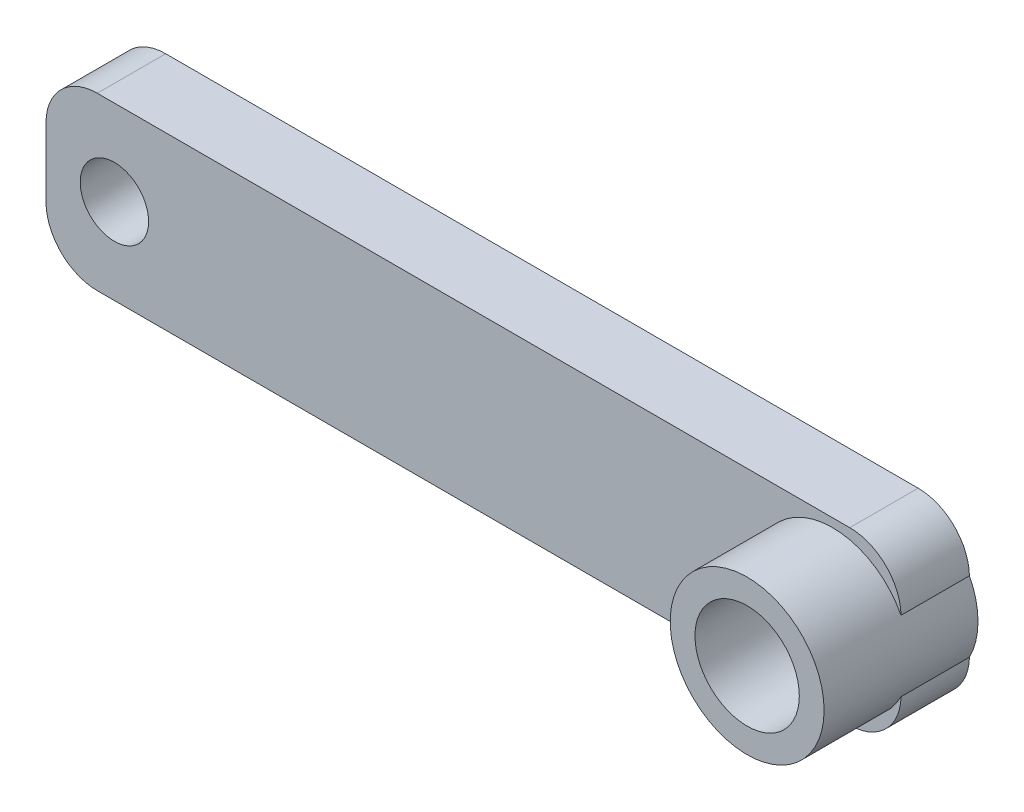
ISO-10303-21;
HEADER;
FILE_DESCRIPTION(('STEP AP214'),'2;1');
FILE_NAME('part.step','',(''),(''),'','','');
FILE_SCHEMA(('AUTOMOTIVE_DESIGN { 1 0 10303 214 1 1 1 1 }'));
ENDSEC;
DATA;
#1=APPLICATION_CONTEXT('core data for automotive mechanical design processes');
#2=APPLICATION_PROTOCOL_DEFINITION('international standard','automotive_design',2000,#1);
#3=PRODUCT_CONTEXT('',#1,'mechanical');
#4=PRODUCT('Part','Part','',(#3));
#5=PRODUCT_RELATED_PRODUCT_CATEGORY('part','',(#4));
#6=PRODUCT_DEFINITION_FORMATION('','',#4);
#7=PRODUCT_DEFINITION_CONTEXT('part definition',#1,'design');
#8=PRODUCT_DEFINITION('design','',#6,#7);
#9=PRODUCT_DEFINITION_SHAPE('','',#8);
#10=(LENGTH_UNIT() NAMED_UNIT(*) SI_UNIT(.MILLI.,.METRE.));
#11=(NAMED_UNIT(*) PLANE_ANGLE_UNIT() SI_UNIT($,.RADIAN.));
#12=(NAMED_UNIT(*) SI_UNIT($,.STERADIAN.) SOLID_ANGLE_UNIT());
#13=UNCERTAINTY_MEASURE_WITH_UNIT(LENGTH_MEASURE(1.E-05),#10,'distance_accuracy_value','');
#14=(GEOMETRIC_REPRESENTATION_CONTEXT(3) GLOBAL_UNCERTAINTY_ASSIGNED_CONTEXT((#13)) GLOBAL_UNIT_ASSIGNED_CONTEXT((#10,
#11,#12)) REPRESENTATION_CONTEXT('',''));
#15=CARTESIAN_POINT('',(0.,0.,0.));
#16=DIRECTION('',(0.,0.,1.));
#17=DIRECTION('',(1.,0.,0.));
#18=AXIS2_PLACEMENT_3D('',#15,#16,#17);
#19=CARTESIAN_POINT('',(0.,0.,4.));
#20=DIRECTION('',(0.,0.,1.));
#21=DIRECTION('',(1.,0.,0.));
#22=AXIS2_PLACEMENT_3D('',#19,#20,#21);
#23=PLANE('',#22);
#24=DIRECTION('',(1.,0.,0.));
#25=VECTOR('',#24,1.);
#26=CARTESIAN_POINT('',(-25.,-4.99999999999999,4.));
#27=LINE('',#26,#25);
#28=CARTESIAN_POINT('',(-22.,-4.99999999999999,4.));
#29=VERTEX_POINT('',#28);
#30=CARTESIAN_POINT('',(22.000631524598,-4.99999999999998,4.));
#31=VERTEX_POINT('',#30);
#32=EDGE_CURVE('E135',#29,#31,#27,.T.);
#33=ORIENTED_EDGE('',*,*,#32,.T.);
#34=CARTESIAN_POINT('',(22.000631524598,-1.99999999999998,4.));
#35=DIRECTION('',(0.,0.,1.));
#36=DIRECTION('',(1.,0.,0.));
#37=AXIS2_PLACEMENT_3D('',#34,#35,#36);
#38=CIRCLE('',#37,3.);
#39=CARTESIAN_POINT('',(25.,-2.06155281280883,4.));
#40=VERTEX_POINT('',#39);
#41=EDGE_CURVE('E168',#31,#40,#38,.T.);
#42=ORIENTED_EDGE('',*,*,#41,.T.);
#43=CARTESIAN_POINT('',(21.,0.,4.));
#44=DIRECTION('',(0.,0.,1.));
#45=DIRECTION('',(1.,0.,0.));
#46=AXIS2_PLACEMENT_3D('',#43,#44,#45);
#47=CIRCLE('',#46,4.5);
#48=CARTESIAN_POINT('',(25.,2.06155281280882,4.));
#49=VERTEX_POINT('',#48);
#50=EDGE_CURVE('E129',#49,#40,#47,.T.);
#51=ORIENTED_EDGE('',*,*,#50,.F.);
#52=CARTESIAN_POINT('',(22.000631524598,1.99999999999999,4.));
#53=DIRECTION('',(0.,0.,1.));
#54=DIRECTION('',(1.,0.,0.));
#55=AXIS2_PLACEMENT_3D('',#52,#53,#54);
#56=CIRCLE('',#55,3.);
#57=CARTESIAN_POINT('',(22.000631524598,4.99999999999999,4.));
#58=VERTEX_POINT('',#57);
#59=EDGE_CURVE('E133',#49,#58,#56,.T.);
#60=ORIENTED_EDGE('',*,*,#59,.T.);
#61=DIRECTION('',(-1.,0.,0.));
#62=VECTOR('',#61,1.);
#63=CARTESIAN_POINT('',(-25.,5.00000000000001,4.));
#64=LINE('',#63,#62);
#65=CARTESIAN_POINT('',(-22.,5.00000000000001,4.));
#66=VERTEX_POINT('',#65);
#67=EDGE_CURVE('E188',#58,#66,#64,.T.);
#68=ORIENTED_EDGE('',*,*,#67,.T.);
#69=CARTESIAN_POINT('',(-22.,2.00000000000001,4.));
#70=DIRECTION('',(0.,0.,1.));
#71=DIRECTION('',(1.,0.,0.));
#72=AXIS2_PLACEMENT_3D('',#69,#70,#71);
#73=CIRCLE('',#72,3.);
#74=CARTESIAN_POINT('',(-25.,2.00000000000001,4.));
#75=VERTEX_POINT('',#74);
#76=EDGE_CURVE('E59',#66,#75,#73,.T.);
#77=ORIENTED_EDGE('',*,*,#76,.T.);
#78=DIRECTION('',(0.,-1.,0.));
#79=VECTOR('',#78,1.);
#80=CARTESIAN_POINT('',(-25.,5.00000000000001,4.));
#81=LINE('',#80,#79);
#82=CARTESIAN_POINT('',(-25.,-1.99999999999999,4.));
#83=VERTEX_POINT('',#82);
#84=EDGE_CURVE('E142',#75,#83,#81,.T.);
#85=ORIENTED_EDGE('',*,*,#84,.T.);
#86=CARTESIAN_POINT('',(-22.,-1.99999999999999,4.));
#87=DIRECTION('',(0.,0.,1.));
#88=DIRECTION('',(1.,0.,0.));
#89=AXIS2_PLACEMENT_3D('',#86,#87,#88);
#90=CIRCLE('',#89,3.);
#91=EDGE_CURVE('E163',#83,#29,#90,.T.);
#92=ORIENTED_EDGE('',*,*,#91,.T.);
#93=EDGE_LOOP('',(#33,#42,#51,#60,#68,#77,#85,#92));
#94=FACE_BOUND('',#93,.T.);
#95=CARTESIAN_POINT('',(-21.,0.,4.));
#96=DIRECTION('',(0.,0.,1.));
#97=DIRECTION('',(1.,0.,0.));
#98=AXIS2_PLACEMENT_3D('',#95,#96,#97);
#99=CIRCLE('',#98,2.);
#100=CARTESIAN_POINT('',(-19.,0.,4.));
#101=VERTEX_POINT('',#100);
#102=EDGE_CURVE('E189',#101,#101,#99,.T.);
#103=ORIENTED_EDGE('',*,*,#102,.F.);
#104=EDGE_LOOP('',(#103));
#105=FACE_BOUND('',#104,.T.);
#106=ADVANCED_FACE('F38',(#94,#105),#23,.T.);
#107=CARTESIAN_POINT('',(0.,0.,0.));
#108=DIRECTION('',(0.,0.,1.));
#109=DIRECTION('',(1.,0.,0.));
#110=AXIS2_PLACEMENT_3D('',#107,#108,#109);
#111=PLANE('',#110);
#112=CARTESIAN_POINT('',(21.,0.,0.));
#113=DIRECTION('',(0.,0.,1.));
#114=DIRECTION('',(1.,0.,0.));
#115=AXIS2_PLACEMENT_3D('',#112,#113,#114);
#116=CIRCLE('',#115,4.5);
#117=CARTESIAN_POINT('',(25.,-2.06155281280883,0.));
#118=VERTEX_POINT('',#117);
#119=CARTESIAN_POINT('',(25.,2.06155281280882,0.));
#120=VERTEX_POINT('',#119);
#121=EDGE_CURVE('E108',#118,#120,#116,.T.);
#122=ORIENTED_EDGE('',*,*,#121,.F.);
#123=CARTESIAN_POINT('',(22.000631524598,-1.99999999999998,0.));
#124=DIRECTION('',(0.,0.,1.));
#125=DIRECTION('',(1.,0.,0.));
#126=AXIS2_PLACEMENT_3D('',#123,#124,#125);
#127=CIRCLE('',#126,3.);
#128=CARTESIAN_POINT('',(22.000631524598,-4.99999999999998,0.));
#129=VERTEX_POINT('',#128);
#130=EDGE_CURVE('E116',#118,#129,#127,.F.);
#131=ORIENTED_EDGE('',*,*,#130,.T.);
#132=DIRECTION('',(1.,0.,0.));
#133=VECTOR('',#132,1.);
#134=CARTESIAN_POINT('',(-25.,-4.99999999999999,0.));
#135=LINE('',#134,#133);
#136=CARTESIAN_POINT('',(-22.,-4.99999999999999,0.));
#137=VERTEX_POINT('',#136);
#138=EDGE_CURVE('E145',#137,#129,#135,.T.);
#139=ORIENTED_EDGE('',*,*,#138,.F.);
#140=CARTESIAN_POINT('',(-22.,-1.99999999999999,0.));
#141=DIRECTION('',(0.,0.,1.));
#142=DIRECTION('',(1.,0.,0.));
#143=AXIS2_PLACEMENT_3D('',#140,#141,#142);
#144=CIRCLE('',#143,3.);
#145=CARTESIAN_POINT('',(-25.,-1.99999999999999,0.));
#146=VERTEX_POINT('',#145);
#147=EDGE_CURVE('E117',#137,#146,#144,.F.);
#148=ORIENTED_EDGE('',*,*,#147,.T.);
#149=DIRECTION('',(0.,-1.,0.));
#150=VECTOR('',#149,1.);
#151=CARTESIAN_POINT('',(-25.,5.00000000000001,0.));
#152=LINE('',#151,#150);
#153=CARTESIAN_POINT('',(-25.,2.00000000000001,0.));
#154=VERTEX_POINT('',#153);
#155=EDGE_CURVE('E181',#154,#146,#152,.T.);
#156=ORIENTED_EDGE('',*,*,#155,.F.);
#157=CARTESIAN_POINT('',(-22.,2.00000000000001,0.));
#158=DIRECTION('',(0.,0.,1.));
#159=DIRECTION('',(1.,0.,0.));
#160=AXIS2_PLACEMENT_3D('',#157,#158,#159);
#161=CIRCLE('',#160,3.);
#162=CARTESIAN_POINT('',(-22.,5.00000000000001,0.));
#163=VERTEX_POINT('',#162);
#164=EDGE_CURVE('E139',#154,#163,#161,.F.);
#165=ORIENTED_EDGE('',*,*,#164,.T.);
#166=DIRECTION('',(-1.,0.,0.));
#167=VECTOR('',#166,1.);
#168=CARTESIAN_POINT('',(-25.,5.00000000000001,0.));
#169=LINE('',#168,#167);
#170=CARTESIAN_POINT('',(22.000631524598,4.99999999999999,0.));
#171=VERTEX_POINT('',#170);
#172=EDGE_CURVE('E110',#171,#163,#169,.T.);
#173=ORIENTED_EDGE('',*,*,#172,.F.);
#174=CARTESIAN_POINT('',(22.000631524598,1.99999999999999,0.));
#175=DIRECTION('',(0.,0.,1.));
#176=DIRECTION('',(1.,0.,0.));
#177=AXIS2_PLACEMENT_3D('',#174,#175,#176);
#178=CIRCLE('',#177,3.);
#179=EDGE_CURVE('E104',#171,#120,#178,.F.);
#180=ORIENTED_EDGE('',*,*,#179,.T.);
#181=EDGE_LOOP('',(#122,#131,#139,#148,#156,#165,#173,#180));
#182=FACE_BOUND('',#181,.T.);
#183=CARTESIAN_POINT('',(-21.,0.,0.));
#184=DIRECTION('',(0.,0.,1.));
#185=DIRECTION('',(1.,0.,0.));
#186=AXIS2_PLACEMENT_3D('',#183,#184,#185);
#187=CIRCLE('',#186,2.);
#188=CARTESIAN_POINT('',(-19.,0.,0.));
#189=VERTEX_POINT('',#188);
#190=EDGE_CURVE('E196',#189,#189,#187,.T.);
#191=ORIENTED_EDGE('',*,*,#190,.T.);
#192=EDGE_LOOP('',(#191));
#193=FACE_BOUND('',#192,.T.);
#194=CARTESIAN_POINT('',(21.,0.,0.));
#195=DIRECTION('',(0.,0.,1.));
#196=DIRECTION('',(1.,0.,0.));
#197=AXIS2_PLACEMENT_3D('',#194,#195,#196);
#198=CIRCLE('',#197,3.05);
#199=CARTESIAN_POINT('',(24.05,0.,0.));
#200=VERTEX_POINT('',#199);
#201=EDGE_CURVE('E200',#200,#200,#198,.T.);
#202=ORIENTED_EDGE('',*,*,#201,.T.);
#203=EDGE_LOOP('',(#202));
#204=FACE_BOUND('',#203,.T.);
#205=ADVANCED_FACE('F106',(#182,#193,#204),#111,.F.);
#206=CARTESIAN_POINT('',(-25.,5.00000000000001,4.));
#207=DIRECTION('',(0.,-1.,0.));
#208=DIRECTION('',(1.,0.,0.));
#209=AXIS2_PLACEMENT_3D('',#206,#207,#208);
#210=PLANE('',#209);
#211=ORIENTED_EDGE('',*,*,#67,.F.);
#212=DIRECTION('',(0.,0.,1.));
#213=VECTOR('',#212,1.);
#214=CARTESIAN_POINT('',(22.000631524598,4.99999999999999,4.));
#215=LINE('',#214,#213);
#216=EDGE_CURVE('E174',#58,#171,#215,.F.);
#217=ORIENTED_EDGE('',*,*,#216,.T.);
#218=ORIENTED_EDGE('',*,*,#172,.T.);
#219=DIRECTION('',(0.,0.,-1.));
#220=VECTOR('',#219,1.);
#221=CARTESIAN_POINT('',(-22.,5.00000000000001,4.));
#222=LINE('',#221,#220);
#223=EDGE_CURVE('E171',#163,#66,#222,.F.);
#224=ORIENTED_EDGE('',*,*,#223,.T.);
#225=EDGE_LOOP('',(#211,#217,#218,#224));
#226=FACE_BOUND('',#225,.T.);
#227=ADVANCED_FACE('F238',(#226),#210,.F.);
#228=CARTESIAN_POINT('',(-25.,5.00000000000001,4.));
#229=DIRECTION('',(1.,0.,0.));
#230=DIRECTION('',(0.,1.,0.));
#231=AXIS2_PLACEMENT_3D('',#228,#229,#230);
#232=PLANE('',#231);
#233=ORIENTED_EDGE('',*,*,#155,.T.);
#234=DIRECTION('',(0.,0.,-1.));
#235=VECTOR('',#234,1.);
#236=CARTESIAN_POINT('',(-25.,-1.99999999999999,4.));
#237=LINE('',#236,#235);
#238=EDGE_CURVE('E11',#146,#83,#237,.F.);
#239=ORIENTED_EDGE('',*,*,#238,.T.);
#240=ORIENTED_EDGE('',*,*,#84,.F.);
#241=DIRECTION('',(0.,0.,-1.));
#242=VECTOR('',#241,1.);
#243=CARTESIAN_POINT('',(-25.,2.00000000000001,4.));
#244=LINE('',#243,#242);
#245=EDGE_CURVE('E47',#75,#154,#244,.T.);
#246=ORIENTED_EDGE('',*,*,#245,.T.);
#247=EDGE_LOOP('',(#233,#239,#240,#246));
#248=FACE_BOUND('',#247,.T.);
#249=ADVANCED_FACE('F180',(#248),#232,.F.);
#250=CARTESIAN_POINT('',(-25.,-4.99999999999999,4.));
#251=DIRECTION('',(0.,1.,0.));
#252=DIRECTION('',(-1.,0.,0.));
#253=AXIS2_PLACEMENT_3D('',#250,#251,#252);
#254=PLANE('',#253);
#255=ORIENTED_EDGE('',*,*,#138,.T.);
#256=DIRECTION('',(0.,0.,1.));
#257=VECTOR('',#256,1.);
#258=CARTESIAN_POINT('',(22.000631524598,-4.99999999999998,4.));
#259=LINE('',#258,#257);
#260=EDGE_CURVE('E158',#129,#31,#259,.T.);
#261=ORIENTED_EDGE('',*,*,#260,.T.);
#262=ORIENTED_EDGE('',*,*,#32,.F.);
#263=DIRECTION('',(0.,0.,-1.));
#264=VECTOR('',#263,1.);
#265=CARTESIAN_POINT('',(-22.,-4.99999999999999,4.));
#266=LINE('',#265,#264);
#267=EDGE_CURVE('E154',#29,#137,#266,.T.);
#268=ORIENTED_EDGE('',*,*,#267,.T.);
#269=EDGE_LOOP('',(#255,#261,#262,#268));
#270=FACE_BOUND('',#269,.T.);
#271=ADVANCED_FACE('F245',(#270),#254,.F.);
#272=CARTESIAN_POINT('',(-21.,0.,4.));
#273=DIRECTION('',(0.,0.,-1.));
#274=DIRECTION('',(-1.,0.,0.));
#275=AXIS2_PLACEMENT_3D('',#272,#273,#274);
#276=CYLINDRICAL_SURFACE('',#275,2.);
#277=ORIENTED_EDGE('',*,*,#102,.T.);
#278=EDGE_LOOP('',(#277));
#279=FACE_BOUND('',#278,.T.);
#280=ORIENTED_EDGE('',*,*,#190,.F.);
#281=EDGE_LOOP('',(#280));
#282=FACE_BOUND('',#281,.T.);
#283=ADVANCED_FACE('F242',(#279,#282),#276,.F.);
#284=CARTESIAN_POINT('',(21.,0.,4.));
#285=DIRECTION('',(0.,0.,-1.));
#286=DIRECTION('',(-1.,0.,0.));
#287=AXIS2_PLACEMENT_3D('',#284,#285,#286);
#288=CYLINDRICAL_SURFACE('',#287,3.05);
#289=ORIENTED_EDGE('',*,*,#201,.F.);
#290=EDGE_LOOP('',(#289));
#291=FACE_BOUND('',#290,.T.);
#292=CARTESIAN_POINT('',(21.,0.,9.));
#293=DIRECTION('',(0.,0.,1.));
#294=DIRECTION('',(1.,0.,0.));
#295=AXIS2_PLACEMENT_3D('',#292,#293,#294);
#296=CIRCLE('',#295,3.05);
#297=CARTESIAN_POINT('',(24.05,0.,9.));
#298=VERTEX_POINT('',#297);
#299=EDGE_CURVE('E212',#298,#298,#296,.T.);
#300=ORIENTED_EDGE('',*,*,#299,.T.);
#301=EDGE_LOOP('',(#300));
#302=FACE_BOUND('',#301,.T.);
#303=ADVANCED_FACE('F217',(#291,#302),#288,.F.);
#304=CARTESIAN_POINT('',(21.,0.,0.));
#305=DIRECTION('',(0.,0.,1.));
#306=DIRECTION('',(1.,0.,0.));
#307=AXIS2_PLACEMENT_3D('',#304,#305,#306);
#308=CYLINDRICAL_SURFACE('',#307,4.5);
#309=CARTESIAN_POINT('',(21.,0.,9.));
#310=DIRECTION('',(0.,0.,1.));
#311=DIRECTION('',(1.,0.,0.));
#312=AXIS2_PLACEMENT_3D('',#309,#310,#311);
#313=CIRCLE('',#312,4.5);
#314=CARTESIAN_POINT('',(25.5,0.,9.));
#315=VERTEX_POINT('',#314);
#316=EDGE_CURVE('E130',#315,#315,#313,.T.);
#317=ORIENTED_EDGE('',*,*,#316,.F.);
#318=EDGE_LOOP('',(#317));
#319=FACE_BOUND('',#318,.T.);
#320=DIRECTION('',(0.,0.,1.));
#321=VECTOR('',#320,1.);
#322=CARTESIAN_POINT('',(25.,-2.06155281280883,0.));
#323=LINE('',#322,#321);
#324=EDGE_CURVE('E127',#118,#40,#323,.T.);
#325=ORIENTED_EDGE('',*,*,#324,.F.);
#326=ORIENTED_EDGE('',*,*,#121,.T.);
#327=DIRECTION('',(0.,0.,1.));
#328=VECTOR('',#327,1.);
#329=CARTESIAN_POINT('',(25.,2.06155281280882,0.));
#330=LINE('',#329,#328);
#331=EDGE_CURVE('E124',#49,#120,#330,.F.);
#332=ORIENTED_EDGE('',*,*,#331,.F.);
#333=ORIENTED_EDGE('',*,*,#50,.T.);
#334=EDGE_LOOP('',(#325,#326,#332,#333));
#335=FACE_BOUND('',#334,.T.);
#336=ADVANCED_FACE('F122',(#319,#335),#308,.T.);
#337=CARTESIAN_POINT('',(21.,0.,9.));
#338=DIRECTION('',(0.,0.,1.));
#339=DIRECTION('',(1.,0.,0.));
#340=AXIS2_PLACEMENT_3D('',#337,#338,#339);
#341=PLANE('',#340);
#342=ORIENTED_EDGE('',*,*,#316,.T.);
#343=EDGE_LOOP('',(#342));
#344=FACE_BOUND('',#343,.T.);
#345=ORIENTED_EDGE('',*,*,#299,.F.);
#346=EDGE_LOOP('',(#345));
#347=FACE_BOUND('',#346,.T.);
#348=ADVANCED_FACE('F219',(#344,#347),#341,.T.);
#349=CARTESIAN_POINT('',(22.000631524598,-1.99999999999998,0.));
#350=DIRECTION('',(0.,0.,1.));
#351=DIRECTION('',(1.,0.,0.));
#352=AXIS2_PLACEMENT_3D('',#349,#350,#351);
#353=CYLINDRICAL_SURFACE('',#352,3.);
#354=ORIENTED_EDGE('',*,*,#41,.F.);
#355=ORIENTED_EDGE('',*,*,#260,.F.);
#356=ORIENTED_EDGE('',*,*,#130,.F.);
#357=ORIENTED_EDGE('',*,*,#324,.T.);
#358=EDGE_LOOP('',(#354,#355,#356,#357));
#359=FACE_BOUND('',#358,.T.);
#360=ADVANCED_FACE('F221',(#359),#353,.T.);
#361=CARTESIAN_POINT('',(22.000631524598,1.99999999999999,0.));
#362=DIRECTION('',(0.,0.,1.));
#363=DIRECTION('',(1.,0.,0.));
#364=AXIS2_PLACEMENT_3D('',#361,#362,#363);
#365=CYLINDRICAL_SURFACE('',#364,3.);
#366=ORIENTED_EDGE('',*,*,#59,.F.);
#367=ORIENTED_EDGE('',*,*,#331,.T.);
#368=ORIENTED_EDGE('',*,*,#179,.F.);
#369=ORIENTED_EDGE('',*,*,#216,.F.);
#370=EDGE_LOOP('',(#366,#367,#368,#369));
#371=FACE_BOUND('',#370,.T.);
#372=ADVANCED_FACE('F132',(#371),#365,.T.);
#373=CARTESIAN_POINT('',(-22.,-1.99999999999999,4.));
#374=DIRECTION('',(0.,0.,-1.));
#375=DIRECTION('',(-1.,0.,0.));
#376=AXIS2_PLACEMENT_3D('',#373,#374,#375);
#377=CYLINDRICAL_SURFACE('',#376,3.);
#378=ORIENTED_EDGE('',*,*,#91,.F.);
#379=ORIENTED_EDGE('',*,*,#238,.F.);
#380=ORIENTED_EDGE('',*,*,#147,.F.);
#381=ORIENTED_EDGE('',*,*,#267,.F.);
#382=EDGE_LOOP('',(#378,#379,#380,#381));
#383=FACE_BOUND('',#382,.T.);
#384=ADVANCED_FACE('F255',(#383),#377,.T.);
#385=CARTESIAN_POINT('',(-22.,2.00000000000001,4.));
#386=DIRECTION('',(0.,0.,-1.));
#387=DIRECTION('',(-1.,0.,0.));
#388=AXIS2_PLACEMENT_3D('',#385,#386,#387);
#389=CYLINDRICAL_SURFACE('',#388,3.);
#390=ORIENTED_EDGE('',*,*,#76,.F.);
#391=ORIENTED_EDGE('',*,*,#223,.F.);
#392=ORIENTED_EDGE('',*,*,#164,.F.);
#393=ORIENTED_EDGE('',*,*,#245,.F.);
#394=EDGE_LOOP('',(#390,#391,#392,#393));
#395=FACE_BOUND('',#394,.T.);
#396=ADVANCED_FACE('F40',(#395),#389,.T.);
#397=CLOSED_SHELL('',(#106,#205,#227,#249,#271,#283,#303,#336,#348,#360,#372,#384,#396));
#398=MANIFOLD_SOLID_BREP('B2',#397);
#399=ADVANCED_BREP_SHAPE_REPRESENTATION('',(#18,#398),#14);
#400=SHAPE_DEFINITION_REPRESENTATION(#9,#399);
ENDSEC;
END-ISO-10303-21;
